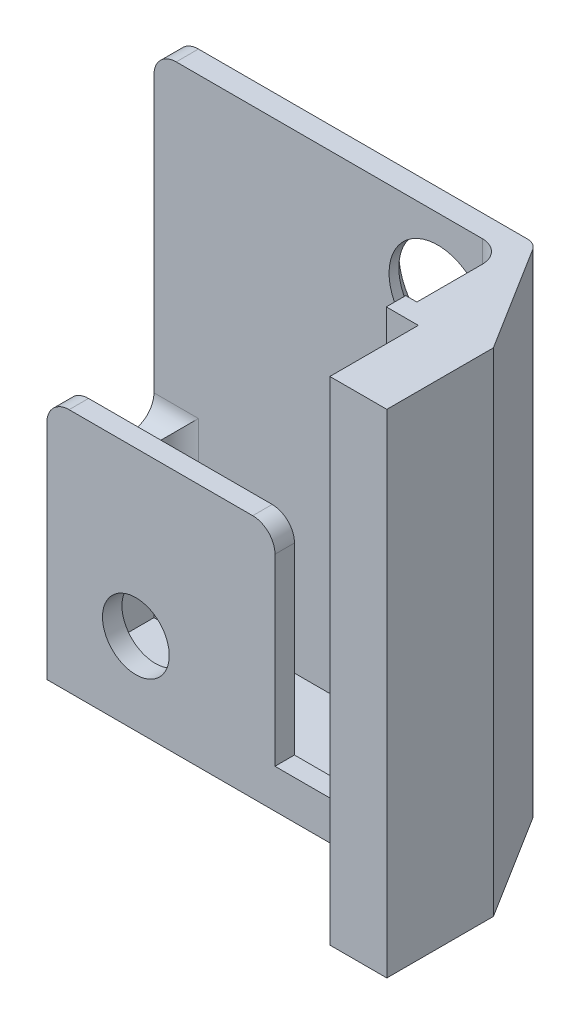
ISO-10303-21;
HEADER;
FILE_DESCRIPTION(('STEP AP214'),'2;1');
FILE_NAME('part.step','',(''),(''),'','','');
FILE_SCHEMA(('AUTOMOTIVE_DESIGN { 1 0 10303 214 1 1 1 1 }'));
ENDSEC;
DATA;
#1=APPLICATION_CONTEXT('core data for automotive mechanical design processes');
#2=APPLICATION_PROTOCOL_DEFINITION('international standard','automotive_design',2000,#1);
#3=PRODUCT_CONTEXT('',#1,'mechanical');
#4=PRODUCT('Part','Part','',(#3));
#5=PRODUCT_RELATED_PRODUCT_CATEGORY('part','',(#4));
#6=PRODUCT_DEFINITION_FORMATION('','',#4);
#7=PRODUCT_DEFINITION_CONTEXT('part definition',#1,'design');
#8=PRODUCT_DEFINITION('design','',#6,#7);
#9=PRODUCT_DEFINITION_SHAPE('','',#8);
#10=(LENGTH_UNIT() NAMED_UNIT(*) SI_UNIT(.MILLI.,.METRE.));
#11=(NAMED_UNIT(*) PLANE_ANGLE_UNIT() SI_UNIT($,.RADIAN.));
#12=(NAMED_UNIT(*) SI_UNIT($,.STERADIAN.) SOLID_ANGLE_UNIT());
#13=UNCERTAINTY_MEASURE_WITH_UNIT(LENGTH_MEASURE(1.E-05),#10,'distance_accuracy_value','');
#14=(GEOMETRIC_REPRESENTATION_CONTEXT(3) GLOBAL_UNCERTAINTY_ASSIGNED_CONTEXT((#13)) GLOBAL_UNIT_ASSIGNED_CONTEXT((#10,
#11,#12)) REPRESENTATION_CONTEXT('',''));
#15=CARTESIAN_POINT('',(0.,0.,0.));
#16=DIRECTION('',(0.,0.,1.));
#17=DIRECTION('',(1.,0.,0.));
#18=AXIS2_PLACEMENT_3D('',#15,#16,#17);
#19=CARTESIAN_POINT('',(15.4,17.7,-10.21));
#20=DIRECTION('',(0.,0.,-1.));
#21=DIRECTION('',(1.,0.,0.));
#22=AXIS2_PLACEMENT_3D('',#19,#20,#21);
#23=PLANE('',#22);
#24=CARTESIAN_POINT('',(10.2,14.95,-10.21));
#25=DIRECTION('',(0.,0.,-1.));
#26=DIRECTION('',(0.,1.,0.));
#27=AXIS2_PLACEMENT_3D('',#24,#25,#26);
#28=CIRCLE('',#27,1.75);
#29=CARTESIAN_POINT('',(11.8,14.2411276560621,-10.21));
#30=VERTEX_POINT('',#29);
#31=CARTESIAN_POINT('',(11.8,15.6588723439379,-10.21));
#32=VERTEX_POINT('',#31);
#33=EDGE_CURVE('E247',#30,#32,#28,.T.);
#34=ORIENTED_EDGE('',*,*,#33,.T.);
#35=DIRECTION('',(0.,-1.,0.));
#36=VECTOR('',#35,1.);
#37=CARTESIAN_POINT('',(11.8,17.7,-10.21));
#38=LINE('',#37,#36);
#39=CARTESIAN_POINT('',(11.8,17.7,-10.21));
#40=VERTEX_POINT('',#39);
#41=EDGE_CURVE('E243',#40,#32,#38,.T.);
#42=ORIENTED_EDGE('',*,*,#41,.F.);
#43=DIRECTION('',(-1.,0.,0.));
#44=VECTOR('',#43,1.);
#45=CARTESIAN_POINT('',(15.4,17.7,-10.21));
#46=LINE('',#45,#44);
#47=CARTESIAN_POINT('',(0.800000000000004,17.7,-10.21));
#48=VERTEX_POINT('',#47);
#49=EDGE_CURVE('E456',#40,#48,#46,.T.);
#50=ORIENTED_EDGE('',*,*,#49,.T.);
#51=CARTESIAN_POINT('',(0.8,16.9,-10.21));
#52=DIRECTION('',(0.,0.,1.));
#53=DIRECTION('',(1.,0.,0.));
#54=AXIS2_PLACEMENT_3D('',#51,#52,#53);
#55=CIRCLE('',#54,0.8);
#56=CARTESIAN_POINT('',(0.,16.9,-10.21));
#57=VERTEX_POINT('',#56);
#58=EDGE_CURVE('E254',#57,#48,#55,.F.);
#59=ORIENTED_EDGE('',*,*,#58,.F.);
#60=DIRECTION('',(0.,1.,0.));
#61=VECTOR('',#60,1.);
#62=CARTESIAN_POINT('',(0.,17.7,-10.21));
#63=LINE('',#62,#61);
#64=CARTESIAN_POINT('',(0.,7.,-10.21));
#65=VERTEX_POINT('',#64);
#66=EDGE_CURVE('E571',#65,#57,#63,.T.);
#67=ORIENTED_EDGE('',*,*,#66,.F.);
#68=DIRECTION('',(-1.,0.,0.));
#69=VECTOR('',#68,1.);
#70=CARTESIAN_POINT('',(0.,7.,-10.21));
#71=LINE('',#70,#69);
#72=CARTESIAN_POINT('',(1.6,7.,-10.21));
#73=VERTEX_POINT('',#72);
#74=EDGE_CURVE('E522',#73,#65,#71,.T.);
#75=ORIENTED_EDGE('',*,*,#74,.F.);
#76=DIRECTION('',(0.,1.,0.));
#77=VECTOR('',#76,1.);
#78=CARTESIAN_POINT('',(1.6,17.7,-10.21));
#79=LINE('',#78,#77);
#80=CARTESIAN_POINT('',(1.6,4.8,-10.21));
#81=VERTEX_POINT('',#80);
#82=EDGE_CURVE('E526',#81,#73,#79,.T.);
#83=ORIENTED_EDGE('',*,*,#82,.F.);
#84=DIRECTION('',(1.,0.,0.));
#85=VECTOR('',#84,1.);
#86=CARTESIAN_POINT('',(0.8,4.8,-10.21));
#87=LINE('',#86,#85);
#88=CARTESIAN_POINT('',(3.2,4.8,-10.21));
#89=VERTEX_POINT('',#88);
#90=EDGE_CURVE('E627',#81,#89,#87,.T.);
#91=ORIENTED_EDGE('',*,*,#90,.T.);
#92=CARTESIAN_POINT('',(3.2,2.95,-10.21));
#93=DIRECTION('',(0.,0.,-1.));
#94=DIRECTION('',(0.,1.,0.));
#95=AXIS2_PLACEMENT_3D('',#92,#93,#94);
#96=CIRCLE('',#95,1.85);
#97=CARTESIAN_POINT('',(5.05,2.95,-10.21));
#98=VERTEX_POINT('',#97);
#99=EDGE_CURVE('E652',#89,#98,#96,.T.);
#100=ORIENTED_EDGE('',*,*,#99,.T.);
#101=DIRECTION('',(0.,-1.,0.));
#102=VECTOR('',#101,1.);
#103=CARTESIAN_POINT('',(5.05,0.800000000000002,-10.21));
#104=LINE('',#103,#102);
#105=CARTESIAN_POINT('',(5.05,0.800000000000002,-10.21));
#106=VERTEX_POINT('',#105);
#107=EDGE_CURVE('E633',#98,#106,#104,.T.);
#108=ORIENTED_EDGE('',*,*,#107,.T.);
#109=DIRECTION('',(-1.,0.,0.));
#110=VECTOR('',#109,1.);
#111=CARTESIAN_POINT('',(15.4,0.800000000000002,-10.21));
#112=LINE('',#111,#110);
#113=CARTESIAN_POINT('',(11.8,0.800000000000002,-10.21));
#114=VERTEX_POINT('',#113);
#115=EDGE_CURVE('E252',#114,#106,#112,.T.);
#116=ORIENTED_EDGE('',*,*,#115,.F.);
#117=EDGE_CURVE('E240',#30,#114,#38,.T.);
#118=ORIENTED_EDGE('',*,*,#117,.F.);
#119=EDGE_LOOP('',(#34,#42,#50,#59,#67,#75,#83,#91,#100,#108,#116,#118));
#120=FACE_BOUND('',#119,.T.);
#121=ADVANCED_FACE('F48',(#120),#23,.F.);
#122=CARTESIAN_POINT('',(10.2,14.95,-11.01));
#123=DIRECTION('',(0.,0.,-1.));
#124=DIRECTION('',(0.,-1.,0.));
#125=AXIS2_PLACEMENT_3D('',#122,#123,#124);
#126=CONICAL_SURFACE('',#125,2.2,0.785398163397448);
#127=CARTESIAN_POINT('',(10.2,14.95,-11.01));
#128=DIRECTION('',(0.,0.,1.));
#129=DIRECTION('',(0.,-1.,0.));
#130=AXIS2_PLACEMENT_3D('',#127,#128,#129);
#131=CIRCLE('',#130,2.2);
#132=CARTESIAN_POINT('',(10.2,12.75,-11.01));
#133=VERTEX_POINT('',#132);
#134=EDGE_CURVE('E608',#133,#133,#131,.T.);
#135=ORIENTED_EDGE('',*,*,#134,.F.);
#136=EDGE_LOOP('',(#135));
#137=FACE_BOUND('',#136,.T.);
#138=CARTESIAN_POINT('',(10.2,14.95,-10.56));
#139=DIRECTION('',(0.,0.,1.));
#140=DIRECTION('',(0.,-1.,0.));
#141=AXIS2_PLACEMENT_3D('',#138,#139,#140);
#142=CIRCLE('',#141,1.75);
#143=CARTESIAN_POINT('',(10.2,13.2,-10.56));
#144=VERTEX_POINT('',#143);
#145=EDGE_CURVE('E246',#144,#144,#142,.T.);
#146=ORIENTED_EDGE('',*,*,#145,.T.);
#147=EDGE_LOOP('',(#146));
#148=FACE_BOUND('',#147,.T.);
#149=ADVANCED_FACE('F287',(#137,#148),#126,.F.);
#150=CARTESIAN_POINT('',(11.8,17.7,-9.41));
#151=DIRECTION('',(0.,-1.,0.));
#152=DIRECTION('',(0.,0.,1.));
#153=AXIS2_PLACEMENT_3D('',#150,#151,#152);
#154=CYLINDRICAL_SURFACE('',#153,0.8);
#155=CARTESIAN_POINT('',(11.8,14.2411276560621,-10.21));
#156=CARTESIAN_POINT('',(11.8197520033515,14.2856989660172,-10.2099750913729));
#157=CARTESIAN_POINT('',(11.8376280852819,14.3310869894427,-10.2092678789419));
#158=CARTESIAN_POINT('',(11.8695301151469,14.4231797790748,-10.2071396877944));
#159=CARTESIAN_POINT('',(11.8835562359279,14.4698844860642,-10.2057187411296));
#160=CARTESIAN_POINT('',(11.9076557401795,14.5642741124911,-10.2028145392406));
#161=CARTESIAN_POINT('',(11.9177311217147,14.6119585235732,-10.2013313159339));
#162=CARTESIAN_POINT('',(11.9338719277806,14.7080101076177,-10.198762322943));
#163=CARTESIAN_POINT('',(11.9399376056709,14.756377237244,-10.1976765281486));
#164=CARTESIAN_POINT('',(11.9480393413239,14.8537660557022,-10.1961942666576));
#165=CARTESIAN_POINT('',(11.9500498074692,14.902789948169,-10.1958021797047));
#166=CARTESIAN_POINT('',(11.949948317069,15.0008333416383,-10.1958215434533));
#167=CARTESIAN_POINT('',(11.9478363521634,15.0498528426315,-10.1962329957843));
#168=CARTESIAN_POINT('',(11.9395120584169,15.1474703261501,-10.1977526747141));
#169=CARTESIAN_POINT('',(11.9333047251143,15.196068749228,-10.1988600523439));
#170=CARTESIAN_POINT('',(11.9168447560813,15.2925470485341,-10.2014643568254));
#171=CARTESIAN_POINT('',(11.9065934750459,15.3404271598219,-10.2029611531673));
#172=CARTESIAN_POINT('',(11.8823670396819,15.4341857232004,-10.2058415063918));
#173=CARTESIAN_POINT('',(11.8684730898844,15.4800850920066,-10.2072267625974));
#174=CARTESIAN_POINT('',(11.8369857173729,15.5705417228839,-10.2092939754285));
#175=CARTESIAN_POINT('',(11.8193973223879,15.6151007157939,-10.2099768805037));
#176=CARTESIAN_POINT('',(11.8,15.6588723439379,-10.21));
#177=B_SPLINE_CURVE_WITH_KNOTS('',3,(#155,#156,#157,#158,#159,#160,#161,#162,#163,#164,#165,
#166,#167,#168,#169,#170,#171,#172,#173,#174,#175,#176),.UNSPECIFIED.,.F.,.F.,(4,2,2,2,2,2,2,2,
2,2,4),(0.,0.14619105360609,0.29237554280134,0.438486004345154,0.584587232781439,
0.731607627380318,0.878628320126676,1.02547000749487,1.17226254561721,1.31602611255964,
1.45959528635212),.UNSPECIFIED.);
#178=EDGE_CURVE('E63',#30,#32,#177,.T.);
#179=ORIENTED_EDGE('',*,*,#178,.F.);
#180=ORIENTED_EDGE('',*,*,#117,.T.);
#181=CARTESIAN_POINT('',(11.8,0.800000000000002,-9.41));
#182=DIRECTION('',(0.,1.,0.));
#183=DIRECTION('',(0.,0.,1.));
#184=AXIS2_PLACEMENT_3D('',#181,#182,#183);
#185=CIRCLE('',#184,0.8);
#186=CARTESIAN_POINT('',(12.6,0.800000000000002,-9.41));
#187=VERTEX_POINT('',#186);
#188=EDGE_CURVE('E541',#114,#187,#185,.F.);
#189=ORIENTED_EDGE('',*,*,#188,.T.);
#190=DIRECTION('',(0.,-1.,0.));
#191=VECTOR('',#190,1.);
#192=CARTESIAN_POINT('',(12.6,0.,-9.41));
#193=LINE('',#192,#191);
#194=CARTESIAN_POINT('',(12.6,17.7,-9.41));
#195=VERTEX_POINT('',#194);
#196=EDGE_CURVE('E544',#187,#195,#193,.F.);
#197=ORIENTED_EDGE('',*,*,#196,.T.);
#198=CARTESIAN_POINT('',(11.8,17.7,-9.41));
#199=DIRECTION('',(0.,1.,0.));
#200=DIRECTION('',(0.,0.,1.));
#201=AXIS2_PLACEMENT_3D('',#198,#199,#200);
#202=CIRCLE('',#201,0.8);
#203=EDGE_CURVE('E562',#195,#40,#202,.T.);
#204=ORIENTED_EDGE('',*,*,#203,.T.);
#205=ORIENTED_EDGE('',*,*,#41,.T.);
#206=EDGE_LOOP('',(#179,#180,#189,#197,#204,#205));
#207=FACE_BOUND('',#206,.T.);
#208=ADVANCED_FACE('F238',(#207),#154,.F.);
#209=CARTESIAN_POINT('',(15.4,17.7,-6.36));
#210=DIRECTION('',(0.,0.,-1.));
#211=DIRECTION('',(0.,-1.,0.));
#212=AXIS2_PLACEMENT_3D('',#209,#210,#211);
#213=PLANE('',#212);
#214=CARTESIAN_POINT('',(3.2,2.95,-6.35999999999999));
#215=DIRECTION('',(0.,0.,1.));
#216=DIRECTION('',(0.,-1.,0.));
#217=AXIS2_PLACEMENT_3D('',#214,#215,#216);
#218=CIRCLE('',#217,1.2);
#219=CARTESIAN_POINT('',(3.2,1.75,-6.35999999999999));
#220=VERTEX_POINT('',#219);
#221=EDGE_CURVE('E480',#220,#220,#218,.T.);
#222=ORIENTED_EDGE('',*,*,#221,.F.);
#223=EDGE_LOOP('',(#222));
#224=FACE_BOUND('',#223,.T.);
#225=DIRECTION('',(0.,1.,0.));
#226=VECTOR('',#225,1.);
#227=CARTESIAN_POINT('',(13.3525,0.,-6.36));
#228=LINE('',#227,#226);
#229=CARTESIAN_POINT('',(13.3525,0.,-6.36));
#230=VERTEX_POINT('',#229);
#231=CARTESIAN_POINT('',(13.3525,17.7,-6.36));
#232=VERTEX_POINT('',#231);
#233=EDGE_CURVE('E604',#230,#232,#228,.T.);
#234=ORIENTED_EDGE('',*,*,#233,.T.);
#235=DIRECTION('',(-1.,0.,0.));
#236=VECTOR('',#235,1.);
#237=CARTESIAN_POINT('',(15.4,17.7,-6.36));
#238=LINE('',#237,#236);
#239=CARTESIAN_POINT('',(12.2,17.7,-6.36));
#240=VERTEX_POINT('',#239);
#241=EDGE_CURVE('E470',#232,#240,#238,.T.);
#242=ORIENTED_EDGE('',*,*,#241,.T.);
#243=DIRECTION('',(0.,1.,0.));
#244=VECTOR('',#243,1.);
#245=CARTESIAN_POINT('',(12.2,1.4,-6.36));
#246=LINE('',#245,#244);
#247=CARTESIAN_POINT('',(12.2,1.4,-6.36));
#248=VERTEX_POINT('',#247);
#249=EDGE_CURVE('E684',#248,#240,#246,.T.);
#250=ORIENTED_EDGE('',*,*,#249,.F.);
#251=DIRECTION('',(-1.,0.,0.));
#252=VECTOR('',#251,1.);
#253=CARTESIAN_POINT('',(12.2,1.4,-6.36));
#254=LINE('',#253,#252);
#255=CARTESIAN_POINT('',(8.2,1.4,-6.36));
#256=VERTEX_POINT('',#255);
#257=EDGE_CURVE('E667',#248,#256,#254,.T.);
#258=ORIENTED_EDGE('',*,*,#257,.T.);
#259=DIRECTION('',(0.,1.,0.));
#260=VECTOR('',#259,1.);
#261=CARTESIAN_POINT('',(8.2,1.4,-6.36));
#262=LINE('',#261,#260);
#263=CARTESIAN_POINT('',(8.2,8.,-6.36));
#264=VERTEX_POINT('',#263);
#265=EDGE_CURVE('E681',#256,#264,#262,.T.);
#266=ORIENTED_EDGE('',*,*,#265,.T.);
#267=CARTESIAN_POINT('',(7.4,8.,-6.36));
#268=DIRECTION('',(0.,0.,1.));
#269=DIRECTION('',(0.,-1.,0.));
#270=AXIS2_PLACEMENT_3D('',#267,#268,#269);
#271=CIRCLE('',#270,0.8);
#272=CARTESIAN_POINT('',(7.4,8.8,-6.36));
#273=VERTEX_POINT('',#272);
#274=EDGE_CURVE('E490',#273,#264,#271,.F.);
#275=ORIENTED_EDGE('',*,*,#274,.F.);
#276=DIRECTION('',(-1.,0.,0.));
#277=VECTOR('',#276,1.);
#278=CARTESIAN_POINT('',(0.,8.8,-6.36));
#279=LINE('',#278,#277);
#280=CARTESIAN_POINT('',(0.8,8.8,-6.36));
#281=VERTEX_POINT('',#280);
#282=EDGE_CURVE('E596',#273,#281,#279,.T.);
#283=ORIENTED_EDGE('',*,*,#282,.T.);
#284=CARTESIAN_POINT('',(0.8,8.,-6.36));
#285=DIRECTION('',(0.,0.,1.));
#286=DIRECTION('',(0.,-1.,0.));
#287=AXIS2_PLACEMENT_3D('',#284,#285,#286);
#288=CIRCLE('',#287,0.8);
#289=CARTESIAN_POINT('',(0.,8.,-6.36));
#290=VERTEX_POINT('',#289);
#291=EDGE_CURVE('E486',#290,#281,#288,.F.);
#292=ORIENTED_EDGE('',*,*,#291,.F.);
#293=DIRECTION('',(0.,1.,0.));
#294=VECTOR('',#293,1.);
#295=CARTESIAN_POINT('',(0.,17.7,-6.36));
#296=LINE('',#295,#294);
#297=CARTESIAN_POINT('',(0.,0.,-6.36));
#298=VERTEX_POINT('',#297);
#299=EDGE_CURVE('E435',#298,#290,#296,.T.);
#300=ORIENTED_EDGE('',*,*,#299,.F.);
#301=DIRECTION('',(-1.,0.,0.));
#302=VECTOR('',#301,1.);
#303=CARTESIAN_POINT('',(15.4,0.,-6.36));
#304=LINE('',#303,#302);
#305=EDGE_CURVE('E427',#230,#298,#304,.T.);
#306=ORIENTED_EDGE('',*,*,#305,.F.);
#307=EDGE_LOOP('',(#234,#242,#250,#258,#266,#275,#283,#292,#300,#306));
#308=FACE_BOUND('',#307,.T.);
#309=ADVANCED_FACE('F341',(#224,#308),#213,.F.);
#310=CARTESIAN_POINT('',(0.,6.2,-6.359));
#311=DIRECTION('',(0.,-1.,0.));
#312=DIRECTION('',(0.,0.,1.));
#313=AXIS2_PLACEMENT_3D('',#310,#311,#312);
#314=PLANE('',#313);
#315=DIRECTION('',(0.,0.,-1.));
#316=VECTOR('',#315,1.);
#317=CARTESIAN_POINT('',(0.8,6.2,-6.36));
#318=LINE('',#317,#316);
#319=CARTESIAN_POINT('',(0.8,6.2,-7.86));
#320=VERTEX_POINT('',#319);
#321=CARTESIAN_POINT('',(0.8,6.2,-9.41));
#322=VERTEX_POINT('',#321);
#323=EDGE_CURVE('E708',#320,#322,#318,.T.);
#324=ORIENTED_EDGE('',*,*,#323,.T.);
#325=DIRECTION('',(-1.,0.,0.));
#326=VECTOR('',#325,1.);
#327=CARTESIAN_POINT('',(0.8,6.2,-9.41));
#328=LINE('',#327,#326);
#329=CARTESIAN_POINT('',(0.,6.2,-9.41));
#330=VERTEX_POINT('',#329);
#331=EDGE_CURVE('E514',#330,#322,#328,.F.);
#332=ORIENTED_EDGE('',*,*,#331,.F.);
#333=DIRECTION('',(0.,0.,-1.));
#334=VECTOR('',#333,1.);
#335=CARTESIAN_POINT('',(0.,6.2,-6.359));
#336=LINE('',#335,#334);
#337=CARTESIAN_POINT('',(0.,6.2,-7.86));
#338=VERTEX_POINT('',#337);
#339=EDGE_CURVE('E432',#338,#330,#336,.T.);
#340=ORIENTED_EDGE('',*,*,#339,.F.);
#341=DIRECTION('',(1.,0.,0.));
#342=VECTOR('',#341,1.);
#343=CARTESIAN_POINT('',(0.,6.2,-7.86));
#344=LINE('',#343,#342);
#345=EDGE_CURVE('E518',#320,#338,#344,.F.);
#346=ORIENTED_EDGE('',*,*,#345,.F.);
#347=EDGE_LOOP('',(#324,#332,#340,#346));
#348=FACE_BOUND('',#347,.T.);
#349=ADVANCED_FACE('F338',(#348),#314,.F.);
#350=CARTESIAN_POINT('',(15.4,0.800000000000002,-10.21));
#351=DIRECTION('',(0.,-1.,0.));
#352=DIRECTION('',(0.,0.,1.));
#353=AXIS2_PLACEMENT_3D('',#350,#351,#352);
#354=PLANE('',#353);
#355=ORIENTED_EDGE('',*,*,#115,.T.);
#356=DIRECTION('',(0.,0.,-1.));
#357=VECTOR('',#356,1.);
#358=CARTESIAN_POINT('',(5.05,0.800000000000002,-9.41));
#359=LINE('',#358,#357);
#360=CARTESIAN_POINT('',(5.05,0.800000000000002,-9.41));
#361=VERTEX_POINT('',#360);
#362=EDGE_CURVE('E648',#361,#106,#359,.T.);
#363=ORIENTED_EDGE('',*,*,#362,.F.);
#364=DIRECTION('',(-1.,0.,0.));
#365=VECTOR('',#364,1.);
#366=CARTESIAN_POINT('',(0.8,0.800000000000002,-9.41));
#367=LINE('',#366,#365);
#368=CARTESIAN_POINT('',(0.8,0.800000000000002,-9.41));
#369=VERTEX_POINT('',#368);
#370=EDGE_CURVE('E644',#361,#369,#367,.T.);
#371=ORIENTED_EDGE('',*,*,#370,.T.);
#372=DIRECTION('',(0.,0.,-1.));
#373=VECTOR('',#372,1.);
#374=CARTESIAN_POINT('',(0.8,0.800000000000002,-10.21));
#375=LINE('',#374,#373);
#376=CARTESIAN_POINT('',(0.8,0.800000000000002,-7.06));
#377=VERTEX_POINT('',#376);
#378=EDGE_CURVE('E712',#377,#369,#375,.T.);
#379=ORIENTED_EDGE('',*,*,#378,.F.);
#380=DIRECTION('',(-1.,0.,0.));
#381=VECTOR('',#380,1.);
#382=CARTESIAN_POINT('',(15.4,0.800000000000002,-7.06));
#383=LINE('',#382,#381);
#384=CARTESIAN_POINT('',(12.6,0.800000000000002,-7.06));
#385=VERTEX_POINT('',#384);
#386=EDGE_CURVE('E462',#385,#377,#383,.T.);
#387=ORIENTED_EDGE('',*,*,#386,.F.);
#388=DIRECTION('',(0.,0.,1.));
#389=VECTOR('',#388,1.);
#390=CARTESIAN_POINT('',(12.6,0.800000000000002,-10.21));
#391=LINE('',#390,#389);
#392=EDGE_CURVE('E701',#187,#385,#391,.T.);
#393=ORIENTED_EDGE('',*,*,#392,.F.);
#394=ORIENTED_EDGE('',*,*,#188,.F.);
#395=EDGE_LOOP('',(#355,#363,#371,#379,#387,#393,#394));
#396=FACE_BOUND('',#395,.T.);
#397=ADVANCED_FACE('F336',(#396),#354,.F.);
#398=CARTESIAN_POINT('',(0.8,0.,-6.36));
#399=DIRECTION('',(1.,0.,0.));
#400=DIRECTION('',(0.,0.,1.));
#401=AXIS2_PLACEMENT_3D('',#398,#399,#400);
#402=PLANE('',#401);
#403=ORIENTED_EDGE('',*,*,#323,.F.);
#404=CARTESIAN_POINT('',(0.8,7.,-7.86));
#405=DIRECTION('',(-1.,0.,0.));
#406=DIRECTION('',(0.,0.,1.));
#407=AXIS2_PLACEMENT_3D('',#404,#405,#406);
#408=CIRCLE('',#407,0.8);
#409=CARTESIAN_POINT('',(0.8,7.,-7.06));
#410=VERTEX_POINT('',#409);
#411=EDGE_CURVE('E556',#410,#320,#408,.F.);
#412=ORIENTED_EDGE('',*,*,#411,.F.);
#413=DIRECTION('',(0.,-1.,0.));
#414=VECTOR('',#413,1.);
#415=CARTESIAN_POINT('',(0.8,0.800000000000002,-7.06));
#416=LINE('',#415,#414);
#417=EDGE_CURVE('E715',#410,#377,#416,.T.);
#418=ORIENTED_EDGE('',*,*,#417,.T.);
#419=ORIENTED_EDGE('',*,*,#378,.T.);
#420=DIRECTION('',(0.,1.,0.));
#421=VECTOR('',#420,1.);
#422=CARTESIAN_POINT('',(0.8,0.800000000000002,-9.41));
#423=LINE('',#422,#421);
#424=CARTESIAN_POINT('',(0.8,4.8,-9.41));
#425=VERTEX_POINT('',#424);
#426=EDGE_CURVE('E628',#369,#425,#423,.T.);
#427=ORIENTED_EDGE('',*,*,#426,.T.);
#428=DIRECTION('',(0.,1.,0.));
#429=VECTOR('',#428,1.);
#430=CARTESIAN_POINT('',(0.8,0.,-9.41));
#431=LINE('',#430,#429);
#432=EDGE_CURVE('E534',#322,#425,#431,.F.);
#433=ORIENTED_EDGE('',*,*,#432,.F.);
#434=EDGE_LOOP('',(#403,#412,#418,#419,#427,#433));
#435=FACE_BOUND('',#434,.T.);
#436=ADVANCED_FACE('F332',(#435),#402,.T.);
#437=CARTESIAN_POINT('',(15.4,17.7,-11.01));
#438=DIRECTION('',(0.,-1.,0.));
#439=DIRECTION('',(0.,0.,1.));
#440=AXIS2_PLACEMENT_3D('',#437,#438,#439);
#441=PLANE('',#440);
#442=DIRECTION('',(-1.,0.,0.));
#443=VECTOR('',#442,1.);
#444=CARTESIAN_POINT('',(15.4,17.7,-11.01));
#445=LINE('',#444,#443);
#446=CARTESIAN_POINT('',(12.6228761792465,17.7,-11.01));
#447=VERTEX_POINT('',#446);
#448=CARTESIAN_POINT('',(0.800000000000004,17.7,-11.01));
#449=VERTEX_POINT('',#448);
#450=EDGE_CURVE('E453',#447,#449,#445,.T.);
#451=ORIENTED_EDGE('',*,*,#450,.T.);
#452=DIRECTION('',(0.,0.,-1.));
#453=VECTOR('',#452,1.);
#454=CARTESIAN_POINT('',(0.8,17.7,-11.01));
#455=LINE('',#454,#453);
#456=EDGE_CURVE('E548',#48,#449,#455,.T.);
#457=ORIENTED_EDGE('',*,*,#456,.F.);
#458=ORIENTED_EDGE('',*,*,#49,.F.);
#459=ORIENTED_EDGE('',*,*,#203,.F.);
#460=DIRECTION('',(0.,0.,-1.));
#461=VECTOR('',#460,1.);
#462=CARTESIAN_POINT('',(12.6,17.7,-6.36));
#463=LINE('',#462,#461);
#464=CARTESIAN_POINT('',(12.6,17.7,-7.06));
#465=VERTEX_POINT('',#464);
#466=EDGE_CURVE('E688',#465,#195,#463,.T.);
#467=ORIENTED_EDGE('',*,*,#466,.F.);
#468=DIRECTION('',(-1.,0.,0.));
#469=VECTOR('',#468,1.);
#470=CARTESIAN_POINT('',(15.4,17.7,-7.06));
#471=LINE('',#470,#469);
#472=CARTESIAN_POINT('',(12.2,17.7,-7.06));
#473=VERTEX_POINT('',#472);
#474=EDGE_CURVE('E466',#465,#473,#471,.T.);
#475=ORIENTED_EDGE('',*,*,#474,.T.);
#476=DIRECTION('',(0.,0.,1.));
#477=VECTOR('',#476,1.);
#478=CARTESIAN_POINT('',(12.2,17.7,-7.06));
#479=LINE('',#478,#477);
#480=EDGE_CURVE('E666',#473,#240,#479,.T.);
#481=ORIENTED_EDGE('',*,*,#480,.T.);
#482=ORIENTED_EDGE('',*,*,#241,.F.);
#483=DIRECTION('',(0.,0.,-1.));
#484=VECTOR('',#483,1.);
#485=CARTESIAN_POINT('',(13.3525,17.7,-6.36));
#486=LINE('',#485,#484);
#487=CARTESIAN_POINT('',(13.3525,17.7,-3.18));
#488=VERTEX_POINT('',#487);
#489=EDGE_CURVE('E749',#488,#232,#486,.T.);
#490=ORIENTED_EDGE('',*,*,#489,.F.);
#491=DIRECTION('',(-1.,0.,0.));
#492=VECTOR('',#491,1.);
#493=CARTESIAN_POINT('',(13.3525,17.7,-3.18));
#494=LINE('',#493,#492);
#495=CARTESIAN_POINT('',(15.4,17.7,-3.18));
#496=VERTEX_POINT('',#495);
#497=EDGE_CURVE('E419',#496,#488,#494,.T.);
#498=ORIENTED_EDGE('',*,*,#497,.F.);
#499=DIRECTION('',(0.,0.,-1.));
#500=VECTOR('',#499,1.);
#501=CARTESIAN_POINT('',(15.4,17.7,-7.06));
#502=LINE('',#501,#500);
#503=CARTESIAN_POINT('',(15.4,17.7,-7.00999999999998));
#504=VERTEX_POINT('',#503);
#505=EDGE_CURVE('E415',#496,#504,#502,.T.);
#506=ORIENTED_EDGE('',*,*,#505,.T.);
#507=DIRECTION('',(-0.529998940003179,0.,-0.847998304005089));
#508=VECTOR('',#507,1.);
#509=CARTESIAN_POINT('',(15.4,17.7,-7.00999999999999));
#510=LINE('',#509,#508);
#511=CARTESIAN_POINT('',(13.046875331249,17.7,-10.7749994700016));
#512=VERTEX_POINT('',#511);
#513=EDGE_CURVE('E403',#512,#504,#510,.F.);
#514=ORIENTED_EDGE('',*,*,#513,.F.);
#515=CARTESIAN_POINT('',(12.6228761792465,17.7,-10.51));
#516=DIRECTION('',(0.,1.,0.));
#517=DIRECTION('',(0.,0.,1.));
#518=AXIS2_PLACEMENT_3D('',#515,#516,#517);
#519=CIRCLE('',#518,0.5);
#520=EDGE_CURVE('E579',#447,#512,#519,.F.);
#521=ORIENTED_EDGE('',*,*,#520,.F.);
#522=EDGE_LOOP('',(#451,#457,#458,#459,#467,#475,#481,#482,#490,#498,#506,#514,#521));
#523=FACE_BOUND('',#522,.T.);
#524=ADVANCED_FACE('F335',(#523),#441,.F.);
#525=CARTESIAN_POINT('',(15.4,0.800000000000002,-7.06));
#526=DIRECTION('',(0.,0.,1.));
#527=DIRECTION('',(0.,1.,0.));
#528=AXIS2_PLACEMENT_3D('',#525,#526,#527);
#529=PLANE('',#528);
#530=CARTESIAN_POINT('',(3.2,2.95,-7.06));
#531=DIRECTION('',(0.,0.,-1.));
#532=DIRECTION('',(0.,1.,0.));
#533=AXIS2_PLACEMENT_3D('',#530,#531,#532);
#534=CIRCLE('',#533,1.2);
#535=CARTESIAN_POINT('',(3.2,4.15,-7.06));
#536=VERTEX_POINT('',#535);
#537=EDGE_CURVE('E479',#536,#536,#534,.T.);
#538=ORIENTED_EDGE('',*,*,#537,.F.);
#539=EDGE_LOOP('',(#538));
#540=FACE_BOUND('',#539,.T.);
#541=DIRECTION('',(0.,1.,0.));
#542=VECTOR('',#541,1.);
#543=CARTESIAN_POINT('',(8.2,1.4,-7.06));
#544=LINE('',#543,#542);
#545=CARTESIAN_POINT('',(8.2,1.4,-7.06));
#546=VERTEX_POINT('',#545);
#547=CARTESIAN_POINT('',(8.2,8.,-7.06));
#548=VERTEX_POINT('',#547);
#549=EDGE_CURVE('E692',#546,#548,#544,.T.);
#550=ORIENTED_EDGE('',*,*,#549,.F.);
#551=DIRECTION('',(1.,0.,0.));
#552=VECTOR('',#551,1.);
#553=CARTESIAN_POINT('',(8.2,1.4,-7.06));
#554=LINE('',#553,#552);
#555=CARTESIAN_POINT('',(12.2,1.4,-7.06));
#556=VERTEX_POINT('',#555);
#557=EDGE_CURVE('E674',#546,#556,#554,.T.);
#558=ORIENTED_EDGE('',*,*,#557,.T.);
#559=DIRECTION('',(0.,1.,0.));
#560=VECTOR('',#559,1.);
#561=CARTESIAN_POINT('',(12.2,1.4,-7.06));
#562=LINE('',#561,#560);
#563=EDGE_CURVE('E689',#556,#473,#562,.T.);
#564=ORIENTED_EDGE('',*,*,#563,.T.);
#565=ORIENTED_EDGE('',*,*,#474,.F.);
#566=DIRECTION('',(0.,1.,0.));
#567=VECTOR('',#566,1.);
#568=CARTESIAN_POINT('',(12.6,0.800000000000002,-7.06));
#569=LINE('',#568,#567);
#570=EDGE_CURVE('E705',#385,#465,#569,.T.);
#571=ORIENTED_EDGE('',*,*,#570,.F.);
#572=ORIENTED_EDGE('',*,*,#386,.T.);
#573=ORIENTED_EDGE('',*,*,#417,.F.);
#574=DIRECTION('',(1.,0.,0.));
#575=VECTOR('',#574,1.);
#576=CARTESIAN_POINT('',(0.8,7.,-7.06));
#577=LINE('',#576,#575);
#578=CARTESIAN_POINT('',(0.,7.,-7.06));
#579=VERTEX_POINT('',#578);
#580=EDGE_CURVE('E497',#579,#410,#577,.T.);
#581=ORIENTED_EDGE('',*,*,#580,.F.);
#582=DIRECTION('',(0.,-1.,0.));
#583=VECTOR('',#582,1.);
#584=CARTESIAN_POINT('',(0.,0.800000000000002,-7.06));
#585=LINE('',#584,#583);
#586=CARTESIAN_POINT('',(0.,8.,-7.06));
#587=VERTEX_POINT('',#586);
#588=EDGE_CURVE('E439',#587,#579,#585,.T.);
#589=ORIENTED_EDGE('',*,*,#588,.F.);
#590=CARTESIAN_POINT('',(0.8,8.,-7.06));
#591=DIRECTION('',(0.,0.,-1.));
#592=DIRECTION('',(0.,1.,0.));
#593=AXIS2_PLACEMENT_3D('',#590,#591,#592);
#594=CIRCLE('',#593,0.8);
#595=CARTESIAN_POINT('',(0.8,8.8,-7.06));
#596=VERTEX_POINT('',#595);
#597=EDGE_CURVE('E500',#596,#587,#594,.F.);
#598=ORIENTED_EDGE('',*,*,#597,.F.);
#599=DIRECTION('',(1.,0.,0.));
#600=VECTOR('',#599,1.);
#601=CARTESIAN_POINT('',(0.,8.8,-7.06));
#602=LINE('',#601,#600);
#603=CARTESIAN_POINT('',(7.4,8.8,-7.06));
#604=VERTEX_POINT('',#603);
#605=EDGE_CURVE('E600',#596,#604,#602,.T.);
#606=ORIENTED_EDGE('',*,*,#605,.T.);
#607=CARTESIAN_POINT('',(7.4,8.,-7.06));
#608=DIRECTION('',(0.,0.,-1.));
#609=DIRECTION('',(0.,1.,0.));
#610=AXIS2_PLACEMENT_3D('',#607,#608,#609);
#611=CIRCLE('',#610,0.8);
#612=EDGE_CURVE('E504',#548,#604,#611,.F.);
#613=ORIENTED_EDGE('',*,*,#612,.F.);
#614=EDGE_LOOP('',(#550,#558,#564,#565,#571,#572,#573,#581,#589,#598,#606,#613));
#615=FACE_BOUND('',#614,.T.);
#616=ADVANCED_FACE('F357',(#540,#615),#529,.F.);
#617=CARTESIAN_POINT('',(15.4,0.,-11.01));
#618=DIRECTION('',(0.,0.,1.));
#619=DIRECTION('',(0.,1.,0.));
#620=AXIS2_PLACEMENT_3D('',#617,#618,#619);
#621=PLANE('',#620);
#622=ORIENTED_EDGE('',*,*,#134,.T.);
#623=EDGE_LOOP('',(#622));
#624=FACE_BOUND('',#623,.T.);
#625=CARTESIAN_POINT('',(3.2,2.95,-11.01));
#626=DIRECTION('',(0.,0.,1.));
#627=DIRECTION('',(0.,-1.,0.));
#628=AXIS2_PLACEMENT_3D('',#625,#626,#627);
#629=CIRCLE('',#628,2.2);
#630=CARTESIAN_POINT('',(3.2,0.75,-11.01));
#631=VERTEX_POINT('',#630);
#632=EDGE_CURVE('E613',#631,#631,#629,.T.);
#633=ORIENTED_EDGE('',*,*,#632,.T.);
#634=EDGE_LOOP('',(#633));
#635=FACE_BOUND('',#634,.T.);
#636=DIRECTION('',(-1.,0.,0.));
#637=VECTOR('',#636,1.);
#638=CARTESIAN_POINT('',(15.4,0.,-11.01));
#639=LINE('',#638,#637);
#640=CARTESIAN_POINT('',(12.6228761792465,0.,-11.01));
#641=VERTEX_POINT('',#640);
#642=CARTESIAN_POINT('',(0.,0.,-11.01));
#643=VERTEX_POINT('',#642);
#644=EDGE_CURVE('E449',#641,#643,#639,.T.);
#645=ORIENTED_EDGE('',*,*,#644,.T.);
#646=DIRECTION('',(0.,-1.,0.));
#647=VECTOR('',#646,1.);
#648=CARTESIAN_POINT('',(0.,0.,-11.01));
#649=LINE('',#648,#647);
#650=CARTESIAN_POINT('',(0.,16.9,-11.01));
#651=VERTEX_POINT('',#650);
#652=EDGE_CURVE('E429',#651,#643,#649,.T.);
#653=ORIENTED_EDGE('',*,*,#652,.F.);
#654=CARTESIAN_POINT('',(0.8,16.9,-11.01));
#655=DIRECTION('',(0.,0.,-1.));
#656=DIRECTION('',(0.,1.,0.));
#657=AXIS2_PLACEMENT_3D('',#654,#655,#656);
#658=CIRCLE('',#657,0.8);
#659=EDGE_CURVE('E552',#449,#651,#658,.F.);
#660=ORIENTED_EDGE('',*,*,#659,.F.);
#661=ORIENTED_EDGE('',*,*,#450,.F.);
#662=DIRECTION('',(0.,-1.,0.));
#663=VECTOR('',#662,1.);
#664=CARTESIAN_POINT('',(12.6228761792465,17.7,-11.01));
#665=LINE('',#664,#663);
#666=EDGE_CURVE('E410',#641,#447,#665,.F.);
#667=ORIENTED_EDGE('',*,*,#666,.F.);
#668=EDGE_LOOP('',(#645,#653,#660,#661,#667));
#669=FACE_BOUND('',#668,.T.);
#670=ADVANCED_FACE('F353',(#624,#635,#669),#621,.F.);
#671=CARTESIAN_POINT('',(15.4,0.,-6.36));
#672=DIRECTION('',(0.,1.,0.));
#673=DIRECTION('',(0.,0.,-1.));
#674=AXIS2_PLACEMENT_3D('',#671,#672,#673);
#675=PLANE('',#674);
#676=DIRECTION('',(0.529998940003179,0.,0.847998304005089));
#677=VECTOR('',#676,1.);
#678=CARTESIAN_POINT('',(15.4,0.,-7.00999999999999));
#679=LINE('',#678,#677);
#680=CARTESIAN_POINT('',(15.4,0.,-7.00999999999999));
#681=VERTEX_POINT('',#680);
#682=CARTESIAN_POINT('',(13.046875331249,0.,-10.7749994700016));
#683=VERTEX_POINT('',#682);
#684=EDGE_CURVE('E411',#681,#683,#679,.F.);
#685=ORIENTED_EDGE('',*,*,#684,.F.);
#686=DIRECTION('',(0.,0.,1.));
#687=VECTOR('',#686,1.);
#688=CARTESIAN_POINT('',(15.4,0.,-6.36));
#689=LINE('',#688,#687);
#690=CARTESIAN_POINT('',(15.4,0.,-3.18));
#691=VERTEX_POINT('',#690);
#692=EDGE_CURVE('E421',#681,#691,#689,.T.);
#693=ORIENTED_EDGE('',*,*,#692,.T.);
#694=DIRECTION('',(-1.,0.,0.));
#695=VECTOR('',#694,1.);
#696=CARTESIAN_POINT('',(13.3525,0.,-3.18));
#697=LINE('',#696,#695);
#698=CARTESIAN_POINT('',(13.3525,0.,-3.18));
#699=VERTEX_POINT('',#698);
#700=EDGE_CURVE('E758',#691,#699,#697,.T.);
#701=ORIENTED_EDGE('',*,*,#700,.T.);
#702=DIRECTION('',(0.,0.,-1.));
#703=VECTOR('',#702,1.);
#704=CARTESIAN_POINT('',(13.3525,0.,-6.36));
#705=LINE('',#704,#703);
#706=EDGE_CURVE('E754',#699,#230,#705,.T.);
#707=ORIENTED_EDGE('',*,*,#706,.T.);
#708=ORIENTED_EDGE('',*,*,#305,.T.);
#709=DIRECTION('',(0.,0.,1.));
#710=VECTOR('',#709,1.);
#711=CARTESIAN_POINT('',(0.,0.,-6.36));
#712=LINE('',#711,#710);
#713=EDGE_CURVE('E422',#643,#298,#712,.T.);
#714=ORIENTED_EDGE('',*,*,#713,.F.);
#715=ORIENTED_EDGE('',*,*,#644,.F.);
#716=CARTESIAN_POINT('',(12.6228761792465,0.,-10.51));
#717=DIRECTION('',(0.,-1.,0.));
#718=DIRECTION('',(0.,0.,-1.));
#719=AXIS2_PLACEMENT_3D('',#716,#717,#718);
#720=CIRCLE('',#719,0.5);
#721=EDGE_CURVE('E12',#683,#641,#720,.F.);
#722=ORIENTED_EDGE('',*,*,#721,.F.);
#723=EDGE_LOOP('',(#685,#693,#701,#707,#708,#714,#715,#722));
#724=FACE_BOUND('',#723,.T.);
#725=ADVANCED_FACE('F346',(#724),#675,.F.);
#726=CARTESIAN_POINT('',(15.4,0.,-6.36));
#727=DIRECTION('',(-1.,0.,0.));
#728=DIRECTION('',(0.,0.,-1.));
#729=AXIS2_PLACEMENT_3D('',#726,#727,#728);
#730=PLANE('',#729);
#731=ORIENTED_EDGE('',*,*,#505,.F.);
#732=DIRECTION('',(0.,1.,0.));
#733=VECTOR('',#732,1.);
#734=CARTESIAN_POINT('',(15.4,0.,-3.18));
#735=LINE('',#734,#733);
#736=EDGE_CURVE('E761',#691,#496,#735,.T.);
#737=ORIENTED_EDGE('',*,*,#736,.F.);
#738=ORIENTED_EDGE('',*,*,#692,.F.);
#739=DIRECTION('',(0.,-1.,0.));
#740=VECTOR('',#739,1.);
#741=CARTESIAN_POINT('',(15.4,0.,-7.00999999999999));
#742=LINE('',#741,#740);
#743=EDGE_CURVE('E406',#504,#681,#742,.T.);
#744=ORIENTED_EDGE('',*,*,#743,.F.);
#745=EDGE_LOOP('',(#731,#737,#738,#744));
#746=FACE_BOUND('',#745,.T.);
#747=ADVANCED_FACE('F343',(#746),#730,.F.);
#748=CARTESIAN_POINT('',(0.,0.,-6.36));
#749=DIRECTION('',(-1.,0.,0.));
#750=DIRECTION('',(0.,0.,-1.));
#751=AXIS2_PLACEMENT_3D('',#748,#749,#750);
#752=PLANE('',#751);
#753=ORIENTED_EDGE('',*,*,#588,.T.);
#754=CARTESIAN_POINT('',(0.,7.,-7.86));
#755=DIRECTION('',(1.,0.,0.));
#756=DIRECTION('',(0.,0.,-1.));
#757=AXIS2_PLACEMENT_3D('',#754,#755,#756);
#758=CIRCLE('',#757,0.8);
#759=EDGE_CURVE('E559',#338,#579,#758,.F.);
#760=ORIENTED_EDGE('',*,*,#759,.F.);
#761=ORIENTED_EDGE('',*,*,#339,.T.);
#762=CARTESIAN_POINT('',(0.,7.,-9.41));
#763=DIRECTION('',(1.,0.,0.));
#764=DIRECTION('',(0.,0.,-1.));
#765=AXIS2_PLACEMENT_3D('',#762,#763,#764);
#766=CIRCLE('',#765,0.8);
#767=EDGE_CURVE('E565',#65,#330,#766,.F.);
#768=ORIENTED_EDGE('',*,*,#767,.F.);
#769=ORIENTED_EDGE('',*,*,#66,.T.);
#770=DIRECTION('',(0.,0.,-1.));
#771=VECTOR('',#770,1.);
#772=CARTESIAN_POINT('',(0.,16.9,-10.21));
#773=LINE('',#772,#771);
#774=EDGE_CURVE('E508',#651,#57,#773,.F.);
#775=ORIENTED_EDGE('',*,*,#774,.F.);
#776=ORIENTED_EDGE('',*,*,#652,.T.);
#777=ORIENTED_EDGE('',*,*,#713,.T.);
#778=ORIENTED_EDGE('',*,*,#299,.T.);
#779=DIRECTION('',(0.,0.,1.));
#780=VECTOR('',#779,1.);
#781=CARTESIAN_POINT('',(0.,8.,-6.36));
#782=LINE('',#781,#780);
#783=EDGE_CURVE('E511',#587,#290,#782,.T.);
#784=ORIENTED_EDGE('',*,*,#783,.F.);
#785=EDGE_LOOP('',(#753,#760,#761,#768,#769,#775,#776,#777,#778,#784));
#786=FACE_BOUND('',#785,.T.);
#787=ADVANCED_FACE('F330',(#786),#752,.T.);
#788=CARTESIAN_POINT('',(12.6,0.,-6.36));
#789=DIRECTION('',(-1.,0.,0.));
#790=DIRECTION('',(0.,0.,-1.));
#791=AXIS2_PLACEMENT_3D('',#788,#789,#790);
#792=PLANE('',#791);
#793=ORIENTED_EDGE('',*,*,#392,.T.);
#794=ORIENTED_EDGE('',*,*,#570,.T.);
#795=ORIENTED_EDGE('',*,*,#466,.T.);
#796=ORIENTED_EDGE('',*,*,#196,.F.);
#797=EDGE_LOOP('',(#793,#794,#795,#796));
#798=FACE_BOUND('',#797,.T.);
#799=ADVANCED_FACE('F323',(#798),#792,.T.);
#800=CARTESIAN_POINT('',(12.2,1.4,-7.06));
#801=DIRECTION('',(1.,0.,0.));
#802=DIRECTION('',(0.,0.,1.));
#803=AXIS2_PLACEMENT_3D('',#800,#801,#802);
#804=PLANE('',#803);
#805=ORIENTED_EDGE('',*,*,#480,.F.);
#806=ORIENTED_EDGE('',*,*,#563,.F.);
#807=DIRECTION('',(0.,0.,1.));
#808=VECTOR('',#807,1.);
#809=CARTESIAN_POINT('',(12.2,1.4,-7.06));
#810=LINE('',#809,#808);
#811=EDGE_CURVE('E678',#556,#248,#810,.T.);
#812=ORIENTED_EDGE('',*,*,#811,.T.);
#813=ORIENTED_EDGE('',*,*,#249,.T.);
#814=EDGE_LOOP('',(#805,#806,#812,#813));
#815=FACE_BOUND('',#814,.T.);
#816=ADVANCED_FACE('F320',(#815),#804,.F.);
#817=CARTESIAN_POINT('',(8.2,1.4,-6.36));
#818=DIRECTION('',(-1.,0.,0.));
#819=DIRECTION('',(0.,0.,-1.));
#820=AXIS2_PLACEMENT_3D('',#817,#818,#819);
#821=PLANE('',#820);
#822=ORIENTED_EDGE('',*,*,#265,.F.);
#823=DIRECTION('',(0.,0.,-1.));
#824=VECTOR('',#823,1.);
#825=CARTESIAN_POINT('',(8.2,1.4,-6.36));
#826=LINE('',#825,#824);
#827=EDGE_CURVE('E671',#256,#546,#826,.T.);
#828=ORIENTED_EDGE('',*,*,#827,.T.);
#829=ORIENTED_EDGE('',*,*,#549,.T.);
#830=DIRECTION('',(0.,0.,1.));
#831=VECTOR('',#830,1.);
#832=CARTESIAN_POINT('',(8.2,8.,-6.36));
#833=LINE('',#832,#831);
#834=EDGE_CURVE('E494',#264,#548,#833,.F.);
#835=ORIENTED_EDGE('',*,*,#834,.F.);
#836=EDGE_LOOP('',(#822,#828,#829,#835));
#837=FACE_BOUND('',#836,.T.);
#838=ADVANCED_FACE('F318',(#837),#821,.F.);
#839=CARTESIAN_POINT('',(0.,1.4,-6.36));
#840=DIRECTION('',(0.,1.,0.));
#841=DIRECTION('',(0.,0.,-1.));
#842=AXIS2_PLACEMENT_3D('',#839,#840,#841);
#843=PLANE('',#842);
#844=ORIENTED_EDGE('',*,*,#257,.F.);
#845=ORIENTED_EDGE('',*,*,#811,.F.);
#846=ORIENTED_EDGE('',*,*,#557,.F.);
#847=ORIENTED_EDGE('',*,*,#827,.F.);
#848=EDGE_LOOP('',(#844,#845,#846,#847));
#849=FACE_BOUND('',#848,.T.);
#850=ADVANCED_FACE('F314',(#849),#843,.T.);
#851=CARTESIAN_POINT('',(0.8,4.8,-9.41));
#852=DIRECTION('',(0.,-1.,0.));
#853=DIRECTION('',(1.,0.,0.));
#854=AXIS2_PLACEMENT_3D('',#851,#852,#853);
#855=PLANE('',#854);
#856=DIRECTION('',(1.,0.,0.));
#857=VECTOR('',#856,1.);
#858=CARTESIAN_POINT('',(0.8,4.8,-9.41));
#859=LINE('',#858,#857);
#860=CARTESIAN_POINT('',(3.2,4.8,-9.41));
#861=VERTEX_POINT('',#860);
#862=EDGE_CURVE('E632',#425,#861,#859,.T.);
#863=ORIENTED_EDGE('',*,*,#862,.T.);
#864=DIRECTION('',(0.,0.,-1.));
#865=VECTOR('',#864,1.);
#866=CARTESIAN_POINT('',(3.2,4.8,-9.41));
#867=LINE('',#866,#865);
#868=EDGE_CURVE('E663',#861,#89,#867,.T.);
#869=ORIENTED_EDGE('',*,*,#868,.T.);
#870=ORIENTED_EDGE('',*,*,#90,.F.);
#871=CARTESIAN_POINT('',(1.6,4.8,-9.41));
#872=DIRECTION('',(0.,1.,0.));
#873=DIRECTION('',(1.,0.,0.));
#874=AXIS2_PLACEMENT_3D('',#871,#872,#873);
#875=CIRCLE('',#874,0.8);
#876=EDGE_CURVE('E538',#425,#81,#875,.F.);
#877=ORIENTED_EDGE('',*,*,#876,.F.);
#878=EDGE_LOOP('',(#863,#869,#870,#877));
#879=FACE_BOUND('',#878,.T.);
#880=ADVANCED_FACE('F310',(#879),#855,.F.);
#881=CARTESIAN_POINT('',(3.2,2.95,-9.41));
#882=DIRECTION('',(0.,0.,-1.));
#883=DIRECTION('',(0.,-1.,0.));
#884=AXIS2_PLACEMENT_3D('',#881,#882,#883);
#885=CYLINDRICAL_SURFACE('',#884,1.85);
#886=ORIENTED_EDGE('',*,*,#99,.F.);
#887=ORIENTED_EDGE('',*,*,#868,.F.);
#888=CARTESIAN_POINT('',(3.2,2.95,-9.41));
#889=DIRECTION('',(0.,0.,-1.));
#890=DIRECTION('',(0.,1.,0.));
#891=AXIS2_PLACEMENT_3D('',#888,#889,#890);
#892=CIRCLE('',#891,1.85);
#893=CARTESIAN_POINT('',(5.05,2.95,-9.41));
#894=VERTEX_POINT('',#893);
#895=EDGE_CURVE('E637',#861,#894,#892,.T.);
#896=ORIENTED_EDGE('',*,*,#895,.T.);
#897=DIRECTION('',(0.,0.,-1.));
#898=VECTOR('',#897,1.);
#899=CARTESIAN_POINT('',(5.05,2.95,-9.41));
#900=LINE('',#899,#898);
#901=EDGE_CURVE('E660',#894,#98,#900,.T.);
#902=ORIENTED_EDGE('',*,*,#901,.T.);
#903=EDGE_LOOP('',(#886,#887,#896,#902));
#904=FACE_BOUND('',#903,.T.);
#905=ADVANCED_FACE('F306',(#904),#885,.T.);
#906=CARTESIAN_POINT('',(5.05,0.800000000000002,-9.41));
#907=DIRECTION('',(-1.,0.,0.));
#908=DIRECTION('',(0.,0.,-1.));
#909=AXIS2_PLACEMENT_3D('',#906,#907,#908);
#910=PLANE('',#909);
#911=ORIENTED_EDGE('',*,*,#107,.F.);
#912=ORIENTED_EDGE('',*,*,#901,.F.);
#913=DIRECTION('',(0.,-1.,0.));
#914=VECTOR('',#913,1.);
#915=CARTESIAN_POINT('',(5.05,0.800000000000002,-9.41));
#916=LINE('',#915,#914);
#917=EDGE_CURVE('E641',#894,#361,#916,.T.);
#918=ORIENTED_EDGE('',*,*,#917,.T.);
#919=ORIENTED_EDGE('',*,*,#362,.T.);
#920=EDGE_LOOP('',(#911,#912,#918,#919));
#921=FACE_BOUND('',#920,.T.);
#922=ADVANCED_FACE('F302',(#921),#910,.F.);
#923=CARTESIAN_POINT('',(3.2,2.95,-9.41));
#924=DIRECTION('',(0.,0.,1.));
#925=DIRECTION('',(0.,1.,0.));
#926=AXIS2_PLACEMENT_3D('',#923,#924,#925);
#927=PLANE('',#926);
#928=CARTESIAN_POINT('',(3.2,2.95,-9.41));
#929=DIRECTION('',(0.,0.,-1.));
#930=DIRECTION('',(0.,1.,0.));
#931=AXIS2_PLACEMENT_3D('',#928,#929,#930);
#932=CIRCLE('',#931,1.2);
#933=CARTESIAN_POINT('',(3.2,4.15,-9.41));
#934=VERTEX_POINT('',#933);
#935=EDGE_CURVE('E475',#934,#934,#932,.T.);
#936=ORIENTED_EDGE('',*,*,#935,.T.);
#937=EDGE_LOOP('',(#936));
#938=FACE_BOUND('',#937,.T.);
#939=ORIENTED_EDGE('',*,*,#426,.F.);
#940=ORIENTED_EDGE('',*,*,#370,.F.);
#941=ORIENTED_EDGE('',*,*,#917,.F.);
#942=ORIENTED_EDGE('',*,*,#895,.F.);
#943=ORIENTED_EDGE('',*,*,#862,.F.);
#944=EDGE_LOOP('',(#939,#940,#941,#942,#943));
#945=FACE_BOUND('',#944,.T.);
#946=ADVANCED_FACE('F295',(#938,#945),#927,.T.);
#947=CARTESIAN_POINT('',(3.2,2.95,-11.01));
#948=DIRECTION('',(0.,0.,-1.));
#949=DIRECTION('',(0.,-1.,0.));
#950=AXIS2_PLACEMENT_3D('',#947,#948,#949);
#951=CONICAL_SURFACE('',#950,2.2,0.785398163397447);
#952=CARTESIAN_POINT('',(3.2,2.95,-10.01));
#953=DIRECTION('',(0.,0.,1.));
#954=DIRECTION('',(0.,-1.,0.));
#955=AXIS2_PLACEMENT_3D('',#952,#953,#954);
#956=CIRCLE('',#955,1.2);
#957=CARTESIAN_POINT('',(3.2,1.75,-10.01));
#958=VERTEX_POINT('',#957);
#959=EDGE_CURVE('E617',#958,#958,#956,.T.);
#960=ORIENTED_EDGE('',*,*,#959,.T.);
#961=EDGE_LOOP('',(#960));
#962=FACE_BOUND('',#961,.T.);
#963=ORIENTED_EDGE('',*,*,#632,.F.);
#964=EDGE_LOOP('',(#963));
#965=FACE_BOUND('',#964,.T.);
#966=ADVANCED_FACE('F291',(#962,#965),#951,.F.);
#967=CARTESIAN_POINT('',(3.2,2.95,-11.01));
#968=DIRECTION('',(0.,0.,-1.));
#969=DIRECTION('',(0.,-1.,0.));
#970=AXIS2_PLACEMENT_3D('',#967,#968,#969);
#971=CYLINDRICAL_SURFACE('',#970,1.2);
#972=ORIENTED_EDGE('',*,*,#935,.F.);
#973=EDGE_LOOP('',(#972));
#974=FACE_BOUND('',#973,.T.);
#975=ORIENTED_EDGE('',*,*,#959,.F.);
#976=EDGE_LOOP('',(#975));
#977=FACE_BOUND('',#976,.T.);
#978=ADVANCED_FACE('F294',(#974,#977),#971,.F.);
#979=ORIENTED_EDGE('',*,*,#221,.T.);
#980=EDGE_LOOP('',(#979));
#981=FACE_BOUND('',#980,.T.);
#982=ORIENTED_EDGE('',*,*,#537,.T.);
#983=EDGE_LOOP('',(#982));
#984=FACE_BOUND('',#983,.T.);
#985=ADVANCED_FACE('F285',(#981,#984),#971,.F.);
#986=CARTESIAN_POINT('',(0.,8.8,-18.7274761623926));
#987=DIRECTION('',(0.,-1.,0.));
#988=DIRECTION('',(1.,0.,0.));
#989=AXIS2_PLACEMENT_3D('',#986,#987,#988);
#990=PLANE('',#989);
#991=ORIENTED_EDGE('',*,*,#605,.F.);
#992=DIRECTION('',(0.,0.,1.));
#993=VECTOR('',#992,1.);
#994=CARTESIAN_POINT('',(0.8,8.8,-7.06));
#995=LINE('',#994,#993);
#996=EDGE_CURVE('E474',#281,#596,#995,.F.);
#997=ORIENTED_EDGE('',*,*,#996,.F.);
#998=ORIENTED_EDGE('',*,*,#282,.F.);
#999=DIRECTION('',(0.,0.,1.));
#1000=VECTOR('',#999,1.);
#1001=CARTESIAN_POINT('',(7.4,8.8,-18.7274761623926));
#1002=LINE('',#1001,#1000);
#1003=EDGE_CURVE('E483',#604,#273,#1002,.T.);
#1004=ORIENTED_EDGE('',*,*,#1003,.F.);
#1005=EDGE_LOOP('',(#991,#997,#998,#1004));
#1006=FACE_BOUND('',#1005,.T.);
#1007=ADVANCED_FACE('F281',(#1006),#990,.F.);
#1008=CARTESIAN_POINT('',(7.4,8.,-18.7274761623926));
#1009=DIRECTION('',(0.,0.,1.));
#1010=DIRECTION('',(0.,1.,0.));
#1011=AXIS2_PLACEMENT_3D('',#1008,#1009,#1010);
#1012=CYLINDRICAL_SURFACE('',#1011,0.8);
#1013=ORIENTED_EDGE('',*,*,#612,.T.);
#1014=ORIENTED_EDGE('',*,*,#1003,.T.);
#1015=ORIENTED_EDGE('',*,*,#274,.T.);
#1016=ORIENTED_EDGE('',*,*,#834,.T.);
#1017=EDGE_LOOP('',(#1013,#1014,#1015,#1016));
#1018=FACE_BOUND('',#1017,.T.);
#1019=ADVANCED_FACE('F284',(#1018),#1012,.T.);
#1020=CARTESIAN_POINT('',(0.8,8.,-6.36));
#1021=DIRECTION('',(0.,0.,-1.));
#1022=DIRECTION('',(0.,-1.,0.));
#1023=AXIS2_PLACEMENT_3D('',#1020,#1021,#1022);
#1024=CYLINDRICAL_SURFACE('',#1023,0.8);
#1025=ORIENTED_EDGE('',*,*,#597,.T.);
#1026=ORIENTED_EDGE('',*,*,#783,.T.);
#1027=ORIENTED_EDGE('',*,*,#291,.T.);
#1028=ORIENTED_EDGE('',*,*,#996,.T.);
#1029=EDGE_LOOP('',(#1025,#1026,#1027,#1028));
#1030=FACE_BOUND('',#1029,.T.);
#1031=ADVANCED_FACE('F375',(#1030),#1024,.T.);
#1032=CARTESIAN_POINT('',(15.4,7.,-7.86));
#1033=DIRECTION('',(-1.,0.,0.));
#1034=DIRECTION('',(0.,0.,-1.));
#1035=AXIS2_PLACEMENT_3D('',#1032,#1033,#1034);
#1036=CYLINDRICAL_SURFACE('',#1035,0.8);
#1037=ORIENTED_EDGE('',*,*,#759,.T.);
#1038=ORIENTED_EDGE('',*,*,#580,.T.);
#1039=ORIENTED_EDGE('',*,*,#411,.T.);
#1040=ORIENTED_EDGE('',*,*,#345,.T.);
#1041=EDGE_LOOP('',(#1037,#1038,#1039,#1040));
#1042=FACE_BOUND('',#1041,.T.);
#1043=ADVANCED_FACE('F379',(#1042),#1036,.F.);
#1044=CARTESIAN_POINT('',(15.4,7.,-9.41));
#1045=DIRECTION('',(1.,0.,0.));
#1046=DIRECTION('',(0.,0.,1.));
#1047=AXIS2_PLACEMENT_3D('',#1044,#1045,#1046);
#1048=CYLINDRICAL_SURFACE('',#1047,0.8);
#1049=ORIENTED_EDGE('',*,*,#767,.T.);
#1050=ORIENTED_EDGE('',*,*,#331,.T.);
#1051=CARTESIAN_POINT('',(1.6,7.,-9.41));
#1052=DIRECTION('',(-0.707106781186547,0.707106781186547,0.));
#1053=DIRECTION('',(0.707106781186547,0.707106781186547,0.));
#1054=AXIS2_PLACEMENT_3D('',#1051,#1052,#1053);
#1055=ELLIPSE('',#1054,1.13137084989848,0.8);
#1056=EDGE_CURVE('E568',#322,#73,#1055,.F.);
#1057=ORIENTED_EDGE('',*,*,#1056,.T.);
#1058=ORIENTED_EDGE('',*,*,#74,.T.);
#1059=EDGE_LOOP('',(#1049,#1050,#1057,#1058));
#1060=FACE_BOUND('',#1059,.T.);
#1061=ADVANCED_FACE('F383',(#1060),#1048,.F.);
#1062=CARTESIAN_POINT('',(1.6,17.7,-9.41));
#1063=DIRECTION('',(0.,1.,0.));
#1064=DIRECTION('',(0.,0.,-1.));
#1065=AXIS2_PLACEMENT_3D('',#1062,#1063,#1064);
#1066=CYLINDRICAL_SURFACE('',#1065,0.8);
#1067=ORIENTED_EDGE('',*,*,#876,.T.);
#1068=ORIENTED_EDGE('',*,*,#82,.T.);
#1069=ORIENTED_EDGE('',*,*,#1056,.F.);
#1070=ORIENTED_EDGE('',*,*,#432,.T.);
#1071=EDGE_LOOP('',(#1067,#1068,#1069,#1070));
#1072=FACE_BOUND('',#1071,.T.);
#1073=ADVANCED_FACE('F385',(#1072),#1066,.F.);
#1074=CARTESIAN_POINT('',(0.8,16.9,-11.01));
#1075=DIRECTION('',(0.,0.,1.));
#1076=DIRECTION('',(-1.,0.,0.));
#1077=AXIS2_PLACEMENT_3D('',#1074,#1075,#1076);
#1078=CYLINDRICAL_SURFACE('',#1077,0.8);
#1079=ORIENTED_EDGE('',*,*,#58,.T.);
#1080=ORIENTED_EDGE('',*,*,#456,.T.);
#1081=ORIENTED_EDGE('',*,*,#659,.T.);
#1082=ORIENTED_EDGE('',*,*,#774,.T.);
#1083=EDGE_LOOP('',(#1079,#1080,#1081,#1082));
#1084=FACE_BOUND('',#1083,.T.);
#1085=ADVANCED_FACE('F388',(#1084),#1078,.T.);
#1086=CARTESIAN_POINT('',(15.4,0.,-7.00999999999999));
#1087=DIRECTION('',(-0.847998304005089,0.,0.529998940003179));
#1088=DIRECTION('',(0.,-1.,0.));
#1089=AXIS2_PLACEMENT_3D('',#1086,#1087,#1088);
#1090=PLANE('',#1089);
#1091=ORIENTED_EDGE('',*,*,#513,.T.);
#1092=ORIENTED_EDGE('',*,*,#743,.T.);
#1093=ORIENTED_EDGE('',*,*,#684,.T.);
#1094=DIRECTION('',(0.,1.,0.));
#1095=VECTOR('',#1094,1.);
#1096=CARTESIAN_POINT('',(13.046875331249,0.,-10.7749994700016));
#1097=LINE('',#1096,#1095);
#1098=EDGE_CURVE('E57',#512,#683,#1097,.F.);
#1099=ORIENTED_EDGE('',*,*,#1098,.F.);
#1100=EDGE_LOOP('',(#1091,#1092,#1093,#1099));
#1101=FACE_BOUND('',#1100,.T.);
#1102=ADVANCED_FACE('F279',(#1101),#1090,.F.);
#1103=CARTESIAN_POINT('',(13.3525,0.,-6.36));
#1104=DIRECTION('',(-1.,0.,0.));
#1105=DIRECTION('',(0.,0.,-1.));
#1106=AXIS2_PLACEMENT_3D('',#1103,#1104,#1105);
#1107=PLANE('',#1106);
#1108=ORIENTED_EDGE('',*,*,#489,.T.);
#1109=ORIENTED_EDGE('',*,*,#233,.F.);
#1110=ORIENTED_EDGE('',*,*,#706,.F.);
#1111=DIRECTION('',(0.,1.,0.));
#1112=VECTOR('',#1111,1.);
#1113=CARTESIAN_POINT('',(13.3525,0.,-3.18));
#1114=LINE('',#1113,#1112);
#1115=EDGE_CURVE('E572',#699,#488,#1114,.T.);
#1116=ORIENTED_EDGE('',*,*,#1115,.T.);
#1117=EDGE_LOOP('',(#1108,#1109,#1110,#1116));
#1118=FACE_BOUND('',#1117,.T.);
#1119=ADVANCED_FACE('F275',(#1118),#1107,.T.);
#1120=CARTESIAN_POINT('',(13.3525,0.,-3.18));
#1121=DIRECTION('',(0.,0.,1.));
#1122=DIRECTION('',(-1.,0.,0.));
#1123=AXIS2_PLACEMENT_3D('',#1120,#1121,#1122);
#1124=PLANE('',#1123);
#1125=ORIENTED_EDGE('',*,*,#497,.T.);
#1126=ORIENTED_EDGE('',*,*,#1115,.F.);
#1127=ORIENTED_EDGE('',*,*,#700,.F.);
#1128=ORIENTED_EDGE('',*,*,#736,.T.);
#1129=EDGE_LOOP('',(#1125,#1126,#1127,#1128));
#1130=FACE_BOUND('',#1129,.T.);
#1131=ADVANCED_FACE('F272',(#1130),#1124,.T.);
#1132=CARTESIAN_POINT('',(12.6228761792465,0.,-10.51));
#1133=DIRECTION('',(0.,1.,0.));
#1134=DIRECTION('',(0.,0.,-1.));
#1135=AXIS2_PLACEMENT_3D('',#1132,#1133,#1134);
#1136=CYLINDRICAL_SURFACE('',#1135,0.5);
#1137=ORIENTED_EDGE('',*,*,#721,.T.);
#1138=ORIENTED_EDGE('',*,*,#666,.T.);
#1139=ORIENTED_EDGE('',*,*,#520,.T.);
#1140=ORIENTED_EDGE('',*,*,#1098,.T.);
#1141=EDGE_LOOP('',(#1137,#1138,#1139,#1140));
#1142=FACE_BOUND('',#1141,.T.);
#1143=ADVANCED_FACE('F50',(#1142),#1136,.T.);
#1144=CARTESIAN_POINT('',(10.2,14.95,-3.179));
#1145=DIRECTION('',(0.,0.,-1.));
#1146=DIRECTION('',(0.,-1.,0.));
#1147=AXIS2_PLACEMENT_3D('',#1144,#1145,#1146);
#1148=CYLINDRICAL_SURFACE('',#1147,1.75);
#1149=ORIENTED_EDGE('',*,*,#178,.T.);
#1150=ORIENTED_EDGE('',*,*,#33,.F.);
#1151=EDGE_LOOP('',(#1149,#1150));
#1152=FACE_BOUND('',#1151,.T.);
#1153=ORIENTED_EDGE('',*,*,#145,.F.);
#1154=EDGE_LOOP('',(#1153));
#1155=FACE_BOUND('',#1154,.T.);
#1156=ADVANCED_FACE('F256',(#1152,#1155),#1148,.F.);
#1157=CLOSED_SHELL('',(#121,#149,#208,#309,#349,#397,#436,#524,#616,#670,#725,#747,#787,#799,
#816,#838,#850,#880,#905,#922,#946,#966,#978,#985,#1007,#1019,#1031,#1043,#1061,#1073,#1085,
#1102,#1119,#1131,#1143,#1156));
#1158=MANIFOLD_SOLID_BREP('B2',#1157);
#1159=ADVANCED_BREP_SHAPE_REPRESENTATION('',(#18,#1158),#14);
#1160=SHAPE_DEFINITION_REPRESENTATION(#9,#1159);
ENDSEC;
END-ISO-10303-21;
